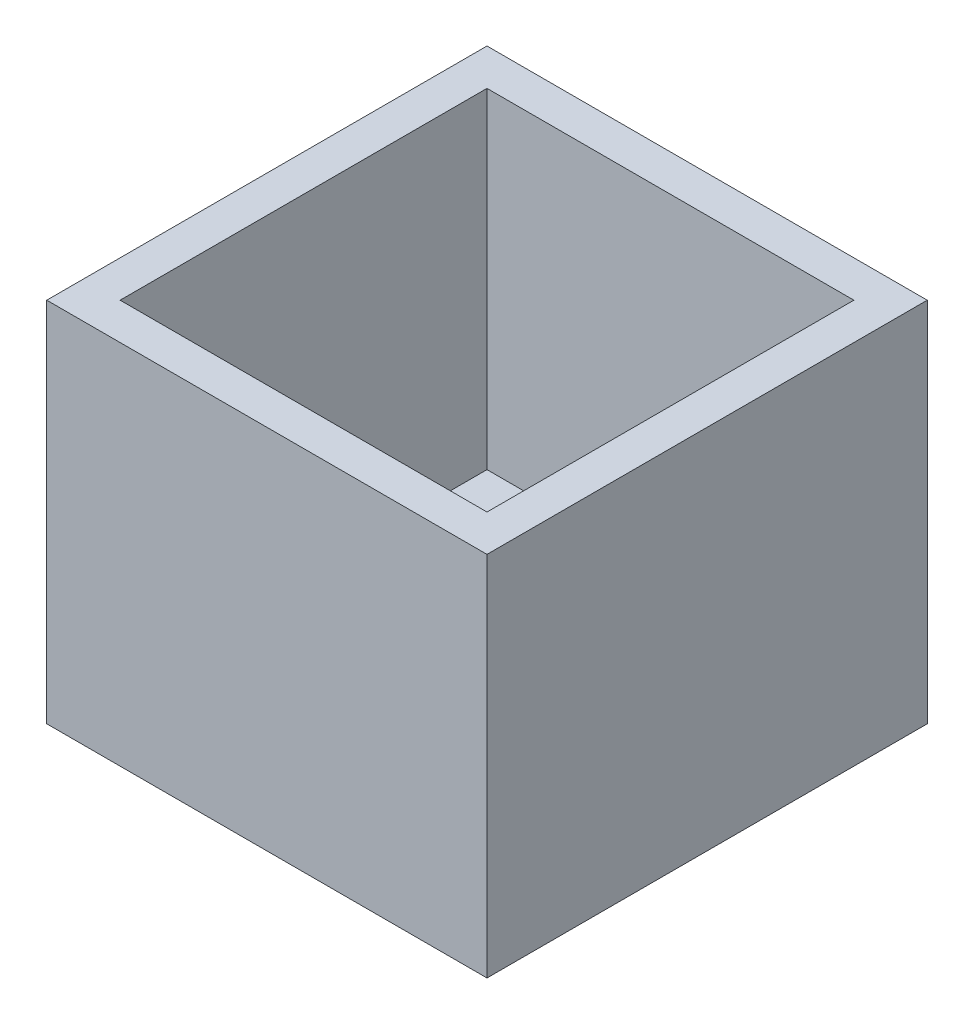
ISO-10303-21;
HEADER;
FILE_DESCRIPTION(('STEP AP214'),'2;1');
FILE_NAME('part.step','',(''),(''),'','','');
FILE_SCHEMA(('AUTOMOTIVE_DESIGN { 1 0 10303 214 1 1 1 1 }'));
ENDSEC;
DATA;
#1=APPLICATION_CONTEXT('core data for automotive mechanical design processes');
#2=APPLICATION_PROTOCOL_DEFINITION('international standard','automotive_design',2000,#1);
#3=PRODUCT_CONTEXT('',#1,'mechanical');
#4=PRODUCT('Part','Part','',(#3));
#5=PRODUCT_RELATED_PRODUCT_CATEGORY('part','',(#4));
#6=PRODUCT_DEFINITION_FORMATION('','',#4);
#7=PRODUCT_DEFINITION_CONTEXT('part definition',#1,'design');
#8=PRODUCT_DEFINITION('design','',#6,#7);
#9=PRODUCT_DEFINITION_SHAPE('','',#8);
#10=(LENGTH_UNIT() NAMED_UNIT(*) SI_UNIT(.MILLI.,.METRE.));
#11=(NAMED_UNIT(*) PLANE_ANGLE_UNIT() SI_UNIT($,.RADIAN.));
#12=(NAMED_UNIT(*) SI_UNIT($,.STERADIAN.) SOLID_ANGLE_UNIT());
#13=UNCERTAINTY_MEASURE_WITH_UNIT(LENGTH_MEASURE(1.E-05),#10,'distance_accuracy_value','');
#14=(GEOMETRIC_REPRESENTATION_CONTEXT(3) GLOBAL_UNCERTAINTY_ASSIGNED_CONTEXT((#13)) GLOBAL_UNIT_ASSIGNED_CONTEXT((#10,
#11,#12)) REPRESENTATION_CONTEXT('',''));
#15=CARTESIAN_POINT('',(0.,0.,0.));
#16=DIRECTION('',(0.,0.,1.));
#17=DIRECTION('',(1.,0.,0.));
#18=AXIS2_PLACEMENT_3D('',#15,#16,#17);
#19=CARTESIAN_POINT('',(60.,100.,-60.));
#20=DIRECTION('',(-1.,0.,0.));
#21=DIRECTION('',(0.,0.,1.));
#22=AXIS2_PLACEMENT_3D('',#19,#20,#21);
#23=PLANE('',#22);
#24=DIRECTION('',(0.,0.,-1.));
#25=VECTOR('',#24,1.);
#26=CARTESIAN_POINT('',(60.,0.,-60.));
#27=LINE('',#26,#25);
#28=CARTESIAN_POINT('',(60.,0.,60.));
#29=VERTEX_POINT('',#28);
#30=CARTESIAN_POINT('',(60.,0.,-60.));
#31=VERTEX_POINT('',#30);
#32=EDGE_CURVE('E147',#29,#31,#27,.T.);
#33=ORIENTED_EDGE('',*,*,#32,.T.);
#34=DIRECTION('',(0.,-1.,0.));
#35=VECTOR('',#34,1.);
#36=CARTESIAN_POINT('',(60.,100.,-60.));
#37=LINE('',#36,#35);
#38=CARTESIAN_POINT('',(60.,100.,-60.));
#39=VERTEX_POINT('',#38);
#40=EDGE_CURVE('E11',#39,#31,#37,.T.);
#41=ORIENTED_EDGE('',*,*,#40,.F.);
#42=DIRECTION('',(0.,0.,-1.));
#43=VECTOR('',#42,1.);
#44=CARTESIAN_POINT('',(60.,100.,-60.));
#45=LINE('',#44,#43);
#46=CARTESIAN_POINT('',(60.,100.,60.));
#47=VERTEX_POINT('',#46);
#48=EDGE_CURVE('E151',#47,#39,#45,.T.);
#49=ORIENTED_EDGE('',*,*,#48,.F.);
#50=DIRECTION('',(0.,-1.,0.));
#51=VECTOR('',#50,1.);
#52=CARTESIAN_POINT('',(60.,100.,60.));
#53=LINE('',#52,#51);
#54=EDGE_CURVE('E157',#47,#29,#53,.T.);
#55=ORIENTED_EDGE('',*,*,#54,.T.);
#56=EDGE_LOOP('',(#33,#41,#49,#55));
#57=FACE_BOUND('',#56,.T.);
#58=ADVANCED_FACE('F39',(#57),#23,.F.);
#59=CARTESIAN_POINT('',(-60.,100.,-60.));
#60=DIRECTION('',(0.,0.,1.));
#61=DIRECTION('',(1.,0.,0.));
#62=AXIS2_PLACEMENT_3D('',#59,#60,#61);
#63=PLANE('',#62);
#64=DIRECTION('',(-1.,0.,0.));
#65=VECTOR('',#64,1.);
#66=CARTESIAN_POINT('',(-60.,0.,-60.));
#67=LINE('',#66,#65);
#68=CARTESIAN_POINT('',(-60.,0.,-60.));
#69=VERTEX_POINT('',#68);
#70=EDGE_CURVE('E160',#31,#69,#67,.T.);
#71=ORIENTED_EDGE('',*,*,#70,.T.);
#72=DIRECTION('',(0.,-1.,0.));
#73=VECTOR('',#72,1.);
#74=CARTESIAN_POINT('',(-60.,100.,-60.));
#75=LINE('',#74,#73);
#76=CARTESIAN_POINT('',(-60.,100.,-60.));
#77=VERTEX_POINT('',#76);
#78=EDGE_CURVE('E46',#77,#69,#75,.T.);
#79=ORIENTED_EDGE('',*,*,#78,.F.);
#80=DIRECTION('',(-1.,0.,0.));
#81=VECTOR('',#80,1.);
#82=CARTESIAN_POINT('',(-60.,100.,-60.));
#83=LINE('',#82,#81);
#84=EDGE_CURVE('E90',#39,#77,#83,.T.);
#85=ORIENTED_EDGE('',*,*,#84,.F.);
#86=ORIENTED_EDGE('',*,*,#40,.T.);
#87=EDGE_LOOP('',(#71,#79,#85,#86));
#88=FACE_BOUND('',#87,.T.);
#89=ADVANCED_FACE('F189',(#88),#63,.F.);
#90=CARTESIAN_POINT('',(-60.,100.,-60.));
#91=DIRECTION('',(1.,0.,0.));
#92=DIRECTION('',(0.,0.,-1.));
#93=AXIS2_PLACEMENT_3D('',#90,#91,#92);
#94=PLANE('',#93);
#95=DIRECTION('',(0.,0.,1.));
#96=VECTOR('',#95,1.);
#97=CARTESIAN_POINT('',(-60.,0.,-60.));
#98=LINE('',#97,#96);
#99=CARTESIAN_POINT('',(-60.,0.,60.));
#100=VERTEX_POINT('',#99);
#101=EDGE_CURVE('E162',#69,#100,#98,.T.);
#102=ORIENTED_EDGE('',*,*,#101,.T.);
#103=DIRECTION('',(0.,-1.,0.));
#104=VECTOR('',#103,1.);
#105=CARTESIAN_POINT('',(-60.,100.,60.));
#106=LINE('',#105,#104);
#107=CARTESIAN_POINT('',(-60.,100.,60.));
#108=VERTEX_POINT('',#107);
#109=EDGE_CURVE('E166',#108,#100,#106,.T.);
#110=ORIENTED_EDGE('',*,*,#109,.F.);
#111=DIRECTION('',(0.,0.,1.));
#112=VECTOR('',#111,1.);
#113=CARTESIAN_POINT('',(-60.,100.,-60.));
#114=LINE('',#113,#112);
#115=EDGE_CURVE('E154',#77,#108,#114,.T.);
#116=ORIENTED_EDGE('',*,*,#115,.F.);
#117=ORIENTED_EDGE('',*,*,#78,.T.);
#118=EDGE_LOOP('',(#102,#110,#116,#117));
#119=FACE_BOUND('',#118,.T.);
#120=ADVANCED_FACE('F171',(#119),#94,.F.);
#121=CARTESIAN_POINT('',(-60.,100.,60.));
#122=DIRECTION('',(0.,0.,-1.));
#123=DIRECTION('',(-1.,0.,0.));
#124=AXIS2_PLACEMENT_3D('',#121,#122,#123);
#125=PLANE('',#124);
#126=DIRECTION('',(1.,0.,0.));
#127=VECTOR('',#126,1.);
#128=CARTESIAN_POINT('',(-60.,0.,60.));
#129=LINE('',#128,#127);
#130=EDGE_CURVE('E83',#100,#29,#129,.T.);
#131=ORIENTED_EDGE('',*,*,#130,.T.);
#132=ORIENTED_EDGE('',*,*,#54,.F.);
#133=DIRECTION('',(1.,0.,0.));
#134=VECTOR('',#133,1.);
#135=CARTESIAN_POINT('',(-60.,100.,60.));
#136=LINE('',#135,#134);
#137=EDGE_CURVE('E62',#108,#47,#136,.T.);
#138=ORIENTED_EDGE('',*,*,#137,.F.);
#139=ORIENTED_EDGE('',*,*,#109,.T.);
#140=EDGE_LOOP('',(#131,#132,#138,#139));
#141=FACE_BOUND('',#140,.T.);
#142=ADVANCED_FACE('F179',(#141),#125,.F.);
#143=CARTESIAN_POINT('',(0.,100.,0.));
#144=DIRECTION('',(0.,1.,0.));
#145=DIRECTION('',(0.,0.,1.));
#146=AXIS2_PLACEMENT_3D('',#143,#144,#145);
#147=PLANE('',#146);
#148=DIRECTION('',(0.,0.,-1.));
#149=VECTOR('',#148,1.);
#150=CARTESIAN_POINT('',(50.,100.,-50.));
#151=LINE('',#150,#149);
#152=CARTESIAN_POINT('',(50.,100.,50.));
#153=VERTEX_POINT('',#152);
#154=CARTESIAN_POINT('',(50.,100.,-50.));
#155=VERTEX_POINT('',#154);
#156=EDGE_CURVE('E53',#153,#155,#151,.T.);
#157=ORIENTED_EDGE('',*,*,#156,.F.);
#158=DIRECTION('',(1.,0.,0.));
#159=VECTOR('',#158,1.);
#160=CARTESIAN_POINT('',(-50.,100.,50.));
#161=LINE('',#160,#159);
#162=CARTESIAN_POINT('',(-50.,100.,50.));
#163=VERTEX_POINT('',#162);
#164=EDGE_CURVE('E132',#163,#153,#161,.T.);
#165=ORIENTED_EDGE('',*,*,#164,.F.);
#166=DIRECTION('',(0.,0.,1.));
#167=VECTOR('',#166,1.);
#168=CARTESIAN_POINT('',(-50.,100.,-50.));
#169=LINE('',#168,#167);
#170=CARTESIAN_POINT('',(-50.,100.,-50.));
#171=VERTEX_POINT('',#170);
#172=EDGE_CURVE('E135',#171,#163,#169,.T.);
#173=ORIENTED_EDGE('',*,*,#172,.F.);
#174=DIRECTION('',(-1.,0.,0.));
#175=VECTOR('',#174,1.);
#176=CARTESIAN_POINT('',(-50.,100.,-50.));
#177=LINE('',#176,#175);
#178=EDGE_CURVE('E141',#155,#171,#177,.T.);
#179=ORIENTED_EDGE('',*,*,#178,.F.);
#180=EDGE_LOOP('',(#157,#165,#173,#179));
#181=FACE_BOUND('',#180,.T.);
#182=ORIENTED_EDGE('',*,*,#48,.T.);
#183=ORIENTED_EDGE('',*,*,#84,.T.);
#184=ORIENTED_EDGE('',*,*,#115,.T.);
#185=ORIENTED_EDGE('',*,*,#137,.T.);
#186=EDGE_LOOP('',(#182,#183,#184,#185));
#187=FACE_BOUND('',#186,.T.);
#188=ADVANCED_FACE('F181',(#181,#187),#147,.T.);
#189=CARTESIAN_POINT('',(0.,0.,0.));
#190=DIRECTION('',(0.,1.,0.));
#191=DIRECTION('',(0.,0.,1.));
#192=AXIS2_PLACEMENT_3D('',#189,#190,#191);
#193=PLANE('',#192);
#194=ORIENTED_EDGE('',*,*,#32,.F.);
#195=ORIENTED_EDGE('',*,*,#130,.F.);
#196=ORIENTED_EDGE('',*,*,#101,.F.);
#197=ORIENTED_EDGE('',*,*,#70,.F.);
#198=EDGE_LOOP('',(#194,#195,#196,#197));
#199=FACE_BOUND('',#198,.T.);
#200=ADVANCED_FACE('F175',(#199),#193,.F.);
#201=CARTESIAN_POINT('',(50.,10.,-50.));
#202=DIRECTION('',(1.,0.,0.));
#203=DIRECTION('',(0.,0.,-1.));
#204=AXIS2_PLACEMENT_3D('',#201,#202,#203);
#205=PLANE('',#204);
#206=ORIENTED_EDGE('',*,*,#156,.T.);
#207=DIRECTION('',(0.,1.,0.));
#208=VECTOR('',#207,1.);
#209=CARTESIAN_POINT('',(50.,10.,-50.));
#210=LINE('',#209,#208);
#211=CARTESIAN_POINT('',(50.,10.,-50.));
#212=VERTEX_POINT('',#211);
#213=EDGE_CURVE('E110',#212,#155,#210,.T.);
#214=ORIENTED_EDGE('',*,*,#213,.F.);
#215=DIRECTION('',(0.,0.,-1.));
#216=VECTOR('',#215,1.);
#217=CARTESIAN_POINT('',(50.,10.,-50.));
#218=LINE('',#217,#216);
#219=CARTESIAN_POINT('',(50.,10.,50.));
#220=VERTEX_POINT('',#219);
#221=EDGE_CURVE('E114',#220,#212,#218,.T.);
#222=ORIENTED_EDGE('',*,*,#221,.F.);
#223=DIRECTION('',(0.,1.,0.));
#224=VECTOR('',#223,1.);
#225=CARTESIAN_POINT('',(50.,10.,50.));
#226=LINE('',#225,#224);
#227=EDGE_CURVE('E145',#220,#153,#226,.T.);
#228=ORIENTED_EDGE('',*,*,#227,.T.);
#229=EDGE_LOOP('',(#206,#214,#222,#228));
#230=FACE_BOUND('',#229,.T.);
#231=ADVANCED_FACE('F112',(#230),#205,.F.);
#232=CARTESIAN_POINT('',(-50.,10.,50.));
#233=DIRECTION('',(0.,0.,1.));
#234=DIRECTION('',(1.,0.,0.));
#235=AXIS2_PLACEMENT_3D('',#232,#233,#234);
#236=PLANE('',#235);
#237=ORIENTED_EDGE('',*,*,#164,.T.);
#238=ORIENTED_EDGE('',*,*,#227,.F.);
#239=DIRECTION('',(1.,0.,0.));
#240=VECTOR('',#239,1.);
#241=CARTESIAN_POINT('',(-50.,10.,50.));
#242=LINE('',#241,#240);
#243=CARTESIAN_POINT('',(-50.,10.,50.));
#244=VERTEX_POINT('',#243);
#245=EDGE_CURVE('E120',#244,#220,#242,.T.);
#246=ORIENTED_EDGE('',*,*,#245,.F.);
#247=DIRECTION('',(0.,1.,0.));
#248=VECTOR('',#247,1.);
#249=CARTESIAN_POINT('',(-50.,10.,50.));
#250=LINE('',#249,#248);
#251=EDGE_CURVE('E148',#244,#163,#250,.T.);
#252=ORIENTED_EDGE('',*,*,#251,.T.);
#253=EDGE_LOOP('',(#237,#238,#246,#252));
#254=FACE_BOUND('',#253,.T.);
#255=ADVANCED_FACE('F232',(#254),#236,.F.);
#256=CARTESIAN_POINT('',(-50.,10.,-50.));
#257=DIRECTION('',(-1.,0.,0.));
#258=DIRECTION('',(0.,0.,1.));
#259=AXIS2_PLACEMENT_3D('',#256,#257,#258);
#260=PLANE('',#259);
#261=ORIENTED_EDGE('',*,*,#172,.T.);
#262=ORIENTED_EDGE('',*,*,#251,.F.);
#263=DIRECTION('',(0.,0.,1.));
#264=VECTOR('',#263,1.);
#265=CARTESIAN_POINT('',(-50.,10.,-50.));
#266=LINE('',#265,#264);
#267=CARTESIAN_POINT('',(-50.,10.,-50.));
#268=VERTEX_POINT('',#267);
#269=EDGE_CURVE('E128',#268,#244,#266,.T.);
#270=ORIENTED_EDGE('',*,*,#269,.F.);
#271=DIRECTION('',(0.,1.,0.));
#272=VECTOR('',#271,1.);
#273=CARTESIAN_POINT('',(-50.,10.,-50.));
#274=LINE('',#273,#272);
#275=EDGE_CURVE('E119',#268,#171,#274,.T.);
#276=ORIENTED_EDGE('',*,*,#275,.T.);
#277=EDGE_LOOP('',(#261,#262,#270,#276));
#278=FACE_BOUND('',#277,.T.);
#279=ADVANCED_FACE('F242',(#278),#260,.F.);
#280=CARTESIAN_POINT('',(-50.,10.,-50.));
#281=DIRECTION('',(0.,0.,-1.));
#282=DIRECTION('',(-1.,0.,0.));
#283=AXIS2_PLACEMENT_3D('',#280,#281,#282);
#284=PLANE('',#283);
#285=ORIENTED_EDGE('',*,*,#178,.T.);
#286=ORIENTED_EDGE('',*,*,#275,.F.);
#287=DIRECTION('',(-1.,0.,0.));
#288=VECTOR('',#287,1.);
#289=CARTESIAN_POINT('',(-50.,10.,-50.));
#290=LINE('',#289,#288);
#291=EDGE_CURVE('E123',#212,#268,#290,.T.);
#292=ORIENTED_EDGE('',*,*,#291,.F.);
#293=ORIENTED_EDGE('',*,*,#213,.T.);
#294=EDGE_LOOP('',(#285,#286,#292,#293));
#295=FACE_BOUND('',#294,.T.);
#296=ADVANCED_FACE('F124',(#295),#284,.F.);
#297=CARTESIAN_POINT('',(0.,10.,0.));
#298=DIRECTION('',(0.,1.,0.));
#299=DIRECTION('',(0.,0.,1.));
#300=AXIS2_PLACEMENT_3D('',#297,#298,#299);
#301=PLANE('',#300);
#302=ORIENTED_EDGE('',*,*,#221,.T.);
#303=ORIENTED_EDGE('',*,*,#291,.T.);
#304=ORIENTED_EDGE('',*,*,#269,.T.);
#305=ORIENTED_EDGE('',*,*,#245,.T.);
#306=EDGE_LOOP('',(#302,#303,#304,#305));
#307=FACE_BOUND('',#306,.T.);
#308=ADVANCED_FACE('F130',(#307),#301,.T.);
#309=CLOSED_SHELL('',(#58,#89,#120,#142,#188,#200,#231,#255,#279,#296,#308));
#310=MANIFOLD_SOLID_BREP('B2',#309);
#311=ADVANCED_BREP_SHAPE_REPRESENTATION('',(#18,#310),#14);
#312=SHAPE_DEFINITION_REPRESENTATION(#9,#311);
ENDSEC;
END-ISO-10303-21;
